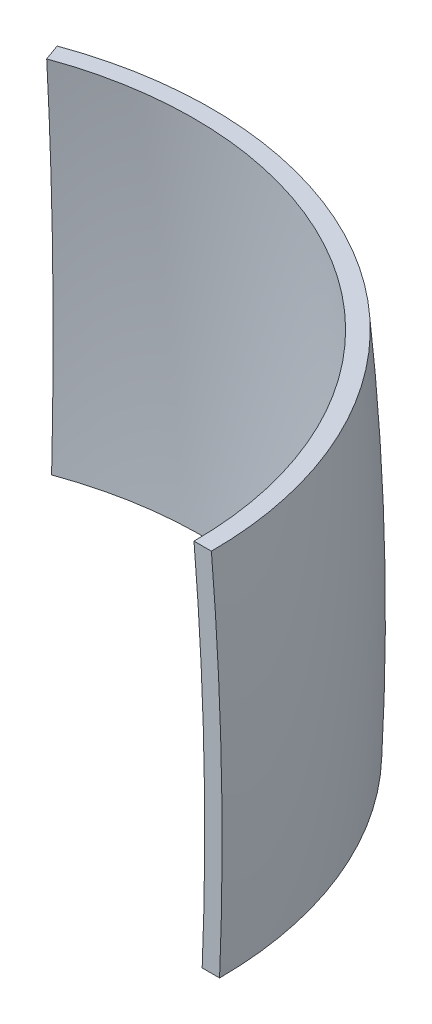
ISO-10303-21;
HEADER;
FILE_DESCRIPTION(('STEP AP214'),'2;1');
FILE_NAME('part.step','',(''),(''),'','','');
FILE_SCHEMA(('AUTOMOTIVE_DESIGN { 1 0 10303 214 1 1 1 1 }'));
ENDSEC;
DATA;
#1=APPLICATION_CONTEXT('core data for automotive mechanical design processes');
#2=APPLICATION_PROTOCOL_DEFINITION('international standard','automotive_design',2000,#1);
#3=PRODUCT_CONTEXT('',#1,'mechanical');
#4=PRODUCT('Part','Part','',(#3));
#5=PRODUCT_RELATED_PRODUCT_CATEGORY('part','',(#4));
#6=PRODUCT_DEFINITION_FORMATION('','',#4);
#7=PRODUCT_DEFINITION_CONTEXT('part definition',#1,'design');
#8=PRODUCT_DEFINITION('design','',#6,#7);
#9=PRODUCT_DEFINITION_SHAPE('','',#8);
#10=(LENGTH_UNIT() NAMED_UNIT(*) SI_UNIT(.MILLI.,.METRE.));
#11=(NAMED_UNIT(*) PLANE_ANGLE_UNIT() SI_UNIT($,.RADIAN.));
#12=(NAMED_UNIT(*) SI_UNIT($,.STERADIAN.) SOLID_ANGLE_UNIT());
#13=UNCERTAINTY_MEASURE_WITH_UNIT(LENGTH_MEASURE(1.E-05),#10,'distance_accuracy_value','');
#14=(GEOMETRIC_REPRESENTATION_CONTEXT(3) GLOBAL_UNCERTAINTY_ASSIGNED_CONTEXT((#13)) GLOBAL_UNIT_ASSIGNED_CONTEXT((#10,
#11,#12)) REPRESENTATION_CONTEXT('',''));
#15=CARTESIAN_POINT('',(0.,0.,0.));
#16=DIRECTION('',(0.,0.,1.));
#17=DIRECTION('',(1.,0.,0.));
#18=AXIS2_PLACEMENT_3D('',#15,#16,#17);
#19=CARTESIAN_POINT('',(0.,28.7359151440656,0.));
#20=DIRECTION('',(0.,-1.,0.));
#21=DIRECTION('',(0.,0.,-1.));
#22=AXIS2_PLACEMENT_3D('',#19,#20,#21);
#23=DEGENERATE_TOROIDAL_SURFACE('',#22,281.689446399997,324.98,.F.);
#24=CARTESIAN_POINT('',(0.,56.9977723754439,0.));
#25=DIRECTION('',(0.,-1.,0.));
#26=DIRECTION('',(0.,0.,-1.));
#27=AXIS2_PLACEMENT_3D('',#24,#25,#26);
#28=CIRCLE('',#27,42.059326301666);
#29=CARTESIAN_POINT('',(-14.385136809877,56.9977723754439,-39.5228385609022));
#30=VERTEX_POINT('',#29);
#31=CARTESIAN_POINT('',(42.059326301666,56.9977723754439,0.));
#32=VERTEX_POINT('',#31);
#33=EDGE_CURVE('E11',#30,#32,#28,.T.);
#34=ORIENTED_EDGE('',*,*,#33,.F.);
#35=CARTESIAN_POINT('',(96.3434648310564,28.7359151440656,264.701494135344));
#36=DIRECTION('',(-0.939692620785907,0.,0.342020143325673));
#37=DIRECTION('',(0.342020143325673,0.,0.939692620785907));
#38=AXIS2_PLACEMENT_3D('',#35,#36,#37);
#39=CIRCLE('',#38,324.98);
#40=CARTESIAN_POINT('',(-14.7068661630039,14.996781384496,-40.406782693794));
#41=VERTEX_POINT('',#40);
#42=EDGE_CURVE('E85',#30,#41,#39,.T.);
#43=ORIENTED_EDGE('',*,*,#42,.T.);
#44=CARTESIAN_POINT('',(0.,14.996781384496,0.));
#45=DIRECTION('',(0.,-1.,0.));
#46=DIRECTION('',(0.,0.,-1.));
#47=AXIS2_PLACEMENT_3D('',#44,#45,#46);
#48=CIRCLE('',#47,43.);
#49=CARTESIAN_POINT('',(43.,14.996781384496,0.));
#50=VERTEX_POINT('',#49);
#51=EDGE_CURVE('E80',#41,#50,#48,.T.);
#52=ORIENTED_EDGE('',*,*,#51,.T.);
#53=CARTESIAN_POINT('',(-281.689446399997,28.7359151440656,0.));
#54=DIRECTION('',(0.,0.,-1.));
#55=DIRECTION('',(-1.,0.,0.));
#56=AXIS2_PLACEMENT_3D('',#53,#54,#55);
#57=CIRCLE('',#56,324.98);
#58=EDGE_CURVE('E83',#32,#50,#57,.T.);
#59=ORIENTED_EDGE('',*,*,#58,.F.);
#60=EDGE_LOOP('',(#34,#43,#52,#59));
#61=FACE_BOUND('',#60,.T.);
#62=ADVANCED_FACE('F43',(#61),#23,.T.);
#63=CARTESIAN_POINT('',(-14.385136809877,56.9977723754439,-39.5228385609022));
#64=DIRECTION('',(0.,1.,0.));
#65=DIRECTION('',(0.,0.,1.));
#66=AXIS2_PLACEMENT_3D('',#63,#64,#65);
#67=PLANE('',#66);
#68=CARTESIAN_POINT('',(0.,56.9977723754439,0.));
#69=DIRECTION('',(0.,-1.,0.));
#70=DIRECTION('',(0.,0.,-1.));
#71=AXIS2_PLACEMENT_3D('',#68,#69,#70);
#72=CIRCLE('',#71,44.059326301666);
#73=CARTESIAN_POINT('',(-15.0691770965284,56.9977723754439,-41.402223802474));
#74=VERTEX_POINT('',#73);
#75=CARTESIAN_POINT('',(44.059326301666,56.9977723754439,0.));
#76=VERTEX_POINT('',#75);
#77=EDGE_CURVE('E52',#74,#76,#72,.T.);
#78=ORIENTED_EDGE('',*,*,#77,.F.);
#79=DIRECTION('',(0.342020143325673,0.,0.939692620785907));
#80=VECTOR('',#79,1.);
#81=CARTESIAN_POINT('',(-14.385136809877,56.9977723754439,-39.5228385609022));
#82=LINE('',#81,#80);
#83=EDGE_CURVE('E91',#74,#30,#82,.T.);
#84=ORIENTED_EDGE('',*,*,#83,.T.);
#85=ORIENTED_EDGE('',*,*,#33,.T.);
#86=DIRECTION('',(-1.,0.,0.));
#87=VECTOR('',#86,1.);
#88=CARTESIAN_POINT('',(42.059326301666,56.9977723754439,0.));
#89=LINE('',#88,#87);
#90=EDGE_CURVE('E104',#76,#32,#89,.T.);
#91=ORIENTED_EDGE('',*,*,#90,.F.);
#92=EDGE_LOOP('',(#78,#84,#85,#91));
#93=FACE_BOUND('',#92,.T.);
#94=ADVANCED_FACE('F45',(#93),#67,.T.);
#95=CARTESIAN_POINT('',(0.,28.7006134082873,0.));
#96=DIRECTION('',(0.,-1.,0.));
#97=DIRECTION('',(0.,0.,-1.));
#98=AXIS2_PLACEMENT_3D('',#95,#96,#97);
#99=DEGENERATE_TOROIDAL_SURFACE('',#98,281.292432867372,326.58,.F.);
#100=CARTESIAN_POINT('',(0.,14.9986189004886,0.));
#101=DIRECTION('',(0.,-1.,0.));
#102=DIRECTION('',(0.,0.,-1.));
#103=AXIS2_PLACEMENT_3D('',#100,#101,#102);
#104=CIRCLE('',#103,45.);
#105=CARTESIAN_POINT('',(-15.3909064496553,14.9986189004886,-42.2861679353659));
#106=VERTEX_POINT('',#105);
#107=CARTESIAN_POINT('',(45.,14.9986189004886,0.));
#108=VERTEX_POINT('',#107);
#109=EDGE_CURVE('E90',#106,#108,#104,.T.);
#110=ORIENTED_EDGE('',*,*,#109,.F.);
#111=CARTESIAN_POINT('',(96.2076782057256,28.7006134082873,264.328423448384));
#112=DIRECTION('',(0.939692620785907,0.,-0.342020143325673));
#113=DIRECTION('',(0.342020143325673,0.,0.939692620785907));
#114=AXIS2_PLACEMENT_3D('',#111,#112,#113);
#115=CIRCLE('',#114,326.58);
#116=EDGE_CURVE('E117',#106,#74,#115,.T.);
#117=ORIENTED_EDGE('',*,*,#116,.T.);
#118=ORIENTED_EDGE('',*,*,#77,.T.);
#119=CARTESIAN_POINT('',(-281.292432867372,28.7006134082873,0.));
#120=DIRECTION('',(0.,0.,1.));
#121=DIRECTION('',(-1.,0.,0.));
#122=AXIS2_PLACEMENT_3D('',#119,#120,#121);
#123=CIRCLE('',#122,326.58);
#124=EDGE_CURVE('E100',#108,#76,#123,.T.);
#125=ORIENTED_EDGE('',*,*,#124,.F.);
#126=EDGE_LOOP('',(#110,#117,#118,#125));
#127=FACE_BOUND('',#126,.T.);
#128=ADVANCED_FACE('F125',(#127),#99,.F.);
#129=CARTESIAN_POINT('',(0.,14.996781384496,0.));
#130=DIRECTION('',(0.,1.,0.));
#131=DIRECTION('',(0.,0.,1.));
#132=AXIS2_PLACEMENT_3D('',#129,#130,#131);
#133=CONICAL_SURFACE('',#132,43.,1.56987756905709);
#134=DIRECTION('',(-0.342019998973383,0.000918757608495604,-0.93969222418125));
#135=VECTOR('',#134,1.);
#136=CARTESIAN_POINT('',(-15.3909064496553,14.9986189004885,-42.2861679353658));
#137=LINE('',#136,#135);
#138=EDGE_CURVE('E114',#41,#106,#137,.T.);
#139=ORIENTED_EDGE('',*,*,#138,.T.);
#140=ORIENTED_EDGE('',*,*,#109,.T.);
#141=DIRECTION('',(0.999999577942139,0.000918757608495604,0.));
#142=VECTOR('',#141,1.);
#143=CARTESIAN_POINT('',(45.,14.9986189004885,0.));
#144=LINE('',#143,#142);
#145=EDGE_CURVE('E94',#50,#108,#144,.T.);
#146=ORIENTED_EDGE('',*,*,#145,.F.);
#147=ORIENTED_EDGE('',*,*,#51,.F.);
#148=EDGE_LOOP('',(#139,#140,#146,#147));
#149=FACE_BOUND('',#148,.T.);
#150=ADVANCED_FACE('F95',(#149),#133,.T.);
#151=CARTESIAN_POINT('',(96.3434648310564,28.7359151440656,264.701494135344));
#152=DIRECTION('',(-0.939692620785907,0.,0.342020143325673));
#153=DIRECTION('',(0.342020143325673,0.,0.939692620785907));
#154=AXIS2_PLACEMENT_3D('',#151,#152,#153);
#155=PLANE('',#154);
#156=ORIENTED_EDGE('',*,*,#42,.F.);
#157=ORIENTED_EDGE('',*,*,#83,.F.);
#158=ORIENTED_EDGE('',*,*,#116,.F.);
#159=ORIENTED_EDGE('',*,*,#138,.F.);
#160=EDGE_LOOP('',(#156,#157,#158,#159));
#161=FACE_BOUND('',#160,.T.);
#162=ADVANCED_FACE('F129',(#161),#155,.T.);
#163=CARTESIAN_POINT('',(-281.689446399997,28.7359151440656,0.));
#164=DIRECTION('',(0.,0.,-1.));
#165=DIRECTION('',(-1.,0.,0.));
#166=AXIS2_PLACEMENT_3D('',#163,#164,#165);
#167=PLANE('',#166);
#168=ORIENTED_EDGE('',*,*,#58,.T.);
#169=ORIENTED_EDGE('',*,*,#145,.T.);
#170=ORIENTED_EDGE('',*,*,#124,.T.);
#171=ORIENTED_EDGE('',*,*,#90,.T.);
#172=EDGE_LOOP('',(#168,#169,#170,#171));
#173=FACE_BOUND('',#172,.T.);
#174=ADVANCED_FACE('F103',(#173),#167,.F.);
#175=CLOSED_SHELL('',(#62,#94,#128,#150,#162,#174));
#176=MANIFOLD_SOLID_BREP('B2',#175);
#177=ADVANCED_BREP_SHAPE_REPRESENTATION('',(#18,#176),#14);
#178=SHAPE_DEFINITION_REPRESENTATION(#9,#177);
ENDSEC;
END-ISO-10303-21;
